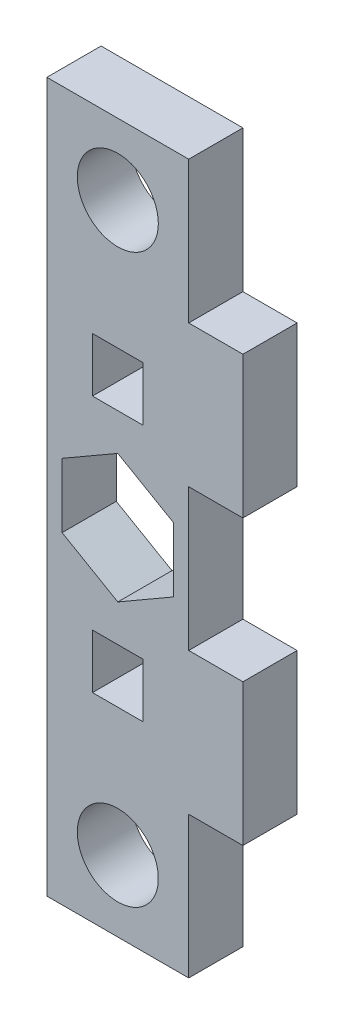
ISO-10303-21;
HEADER;
FILE_DESCRIPTION(('STEP AP214'),'2;1');
FILE_NAME('part.step','',(''),(''),'','','');
FILE_SCHEMA(('AUTOMOTIVE_DESIGN { 1 0 10303 214 1 1 1 1 }'));
ENDSEC;
DATA;
#1=APPLICATION_CONTEXT('core data for automotive mechanical design processes');
#2=APPLICATION_PROTOCOL_DEFINITION('international standard','automotive_design',2000,#1);
#3=PRODUCT_CONTEXT('',#1,'mechanical');
#4=PRODUCT('Part','Part','',(#3));
#5=PRODUCT_RELATED_PRODUCT_CATEGORY('part','',(#4));
#6=PRODUCT_DEFINITION_FORMATION('','',#4);
#7=PRODUCT_DEFINITION_CONTEXT('part definition',#1,'design');
#8=PRODUCT_DEFINITION('design','',#6,#7);
#9=PRODUCT_DEFINITION_SHAPE('','',#8);
#10=(LENGTH_UNIT() NAMED_UNIT(*) SI_UNIT(.MILLI.,.METRE.));
#11=(NAMED_UNIT(*) PLANE_ANGLE_UNIT() SI_UNIT($,.RADIAN.));
#12=(NAMED_UNIT(*) SI_UNIT($,.STERADIAN.) SOLID_ANGLE_UNIT());
#13=UNCERTAINTY_MEASURE_WITH_UNIT(LENGTH_MEASURE(1.E-05),#10,'distance_accuracy_value','');
#14=(GEOMETRIC_REPRESENTATION_CONTEXT(3) GLOBAL_UNCERTAINTY_ASSIGNED_CONTEXT((#13)) GLOBAL_UNIT_ASSIGNED_CONTEXT((#10,
#11,#12)) REPRESENTATION_CONTEXT('',''));
#15=CARTESIAN_POINT('',(0.,0.,0.));
#16=DIRECTION('',(0.,0.,1.));
#17=DIRECTION('',(1.,0.,0.));
#18=AXIS2_PLACEMENT_3D('',#15,#16,#17);
#19=CARTESIAN_POINT('',(0.,0.,5.35));
#20=DIRECTION('',(0.,0.,-1.));
#21=DIRECTION('',(-1.,0.,0.));
#22=AXIS2_PLACEMENT_3D('',#19,#20,#21);
#23=PLANE('',#22);
#24=CARTESIAN_POINT('',(7.,7.00000000000001,5.35));
#25=DIRECTION('',(0.,0.,1.));
#26=DIRECTION('',(-1.,0.,0.));
#27=AXIS2_PLACEMENT_3D('',#24,#25,#26);
#28=CIRCLE('',#27,4.);
#29=CARTESIAN_POINT('',(3.,7.00000000000001,5.35));
#30=VERTEX_POINT('',#29);
#31=EDGE_CURVE('E256',#30,#30,#28,.T.);
#32=ORIENTED_EDGE('',*,*,#31,.F.);
#33=EDGE_LOOP('',(#32));
#34=FACE_BOUND('',#33,.T.);
#35=DIRECTION('',(0.,-1.,0.));
#36=VECTOR('',#35,1.);
#37=CARTESIAN_POINT('',(4.5,25.,5.35));
#38=LINE('',#37,#36);
#39=CARTESIAN_POINT('',(4.5,25.,5.35));
#40=VERTEX_POINT('',#39);
#41=CARTESIAN_POINT('',(4.5,19.65,5.35));
#42=VERTEX_POINT('',#41);
#43=EDGE_CURVE('E262',#40,#42,#38,.T.);
#44=ORIENTED_EDGE('',*,*,#43,.F.);
#45=DIRECTION('',(-1.,0.,0.));
#46=VECTOR('',#45,1.);
#47=CARTESIAN_POINT('',(4.5,25.,5.35));
#48=LINE('',#47,#46);
#49=CARTESIAN_POINT('',(9.5,25.,5.35));
#50=VERTEX_POINT('',#49);
#51=EDGE_CURVE('E270',#50,#40,#48,.T.);
#52=ORIENTED_EDGE('',*,*,#51,.F.);
#53=DIRECTION('',(0.,1.,0.));
#54=VECTOR('',#53,1.);
#55=CARTESIAN_POINT('',(9.5,25.,5.35));
#56=LINE('',#55,#54);
#57=CARTESIAN_POINT('',(9.5,19.65,5.35));
#58=VERTEX_POINT('',#57);
#59=EDGE_CURVE('E267',#58,#50,#56,.T.);
#60=ORIENTED_EDGE('',*,*,#59,.F.);
#61=DIRECTION('',(1.,0.,0.));
#62=VECTOR('',#61,1.);
#63=CARTESIAN_POINT('',(4.5,19.65,5.35));
#64=LINE('',#63,#62);
#65=EDGE_CURVE('E264',#42,#58,#64,.T.);
#66=ORIENTED_EDGE('',*,*,#65,.F.);
#67=EDGE_LOOP('',(#44,#52,#60,#66));
#68=FACE_BOUND('',#67,.T.);
#69=CARTESIAN_POINT('',(7.,63.,5.35));
#70=DIRECTION('',(0.,0.,1.));
#71=DIRECTION('',(1.,0.,0.));
#72=AXIS2_PLACEMENT_3D('',#69,#70,#71);
#73=CIRCLE('',#72,4.);
#74=CARTESIAN_POINT('',(11.,63.,5.35));
#75=VERTEX_POINT('',#74);
#76=EDGE_CURVE('E324',#75,#75,#73,.T.);
#77=ORIENTED_EDGE('',*,*,#76,.F.);
#78=EDGE_LOOP('',(#77));
#79=FACE_BOUND('',#78,.T.);
#80=DIRECTION('',(0.,-1.,0.));
#81=VECTOR('',#80,1.);
#82=CARTESIAN_POINT('',(0.,0.,5.35));
#83=LINE('',#82,#81);
#84=CARTESIAN_POINT('',(0.,70.,5.35));
#85=VERTEX_POINT('',#84);
#86=CARTESIAN_POINT('',(0.,0.,5.35));
#87=VERTEX_POINT('',#86);
#88=EDGE_CURVE('E330',#85,#87,#83,.T.);
#89=ORIENTED_EDGE('',*,*,#88,.T.);
#90=DIRECTION('',(1.,0.,0.));
#91=VECTOR('',#90,1.);
#92=CARTESIAN_POINT('',(0.,0.,5.35));
#93=LINE('',#92,#91);
#94=CARTESIAN_POINT('',(14.,0.,5.35));
#95=VERTEX_POINT('',#94);
#96=EDGE_CURVE('E333',#87,#95,#93,.T.);
#97=ORIENTED_EDGE('',*,*,#96,.T.);
#98=DIRECTION('',(0.,1.,0.));
#99=VECTOR('',#98,1.);
#100=CARTESIAN_POINT('',(14.,0.,5.35));
#101=LINE('',#100,#99);
#102=CARTESIAN_POINT('',(14.,14.,5.35));
#103=VERTEX_POINT('',#102);
#104=EDGE_CURVE('E336',#95,#103,#101,.T.);
#105=ORIENTED_EDGE('',*,*,#104,.T.);
#106=DIRECTION('',(1.,0.,0.));
#107=VECTOR('',#106,1.);
#108=CARTESIAN_POINT('',(14.,14.,5.35));
#109=LINE('',#108,#107);
#110=CARTESIAN_POINT('',(19.35,14.,5.35));
#111=VERTEX_POINT('',#110);
#112=EDGE_CURVE('E338',#103,#111,#109,.T.);
#113=ORIENTED_EDGE('',*,*,#112,.T.);
#114=DIRECTION('',(0.,1.,0.));
#115=VECTOR('',#114,1.);
#116=CARTESIAN_POINT('',(19.35,14.,5.35));
#117=LINE('',#116,#115);
#118=CARTESIAN_POINT('',(19.35,28.,5.35));
#119=VERTEX_POINT('',#118);
#120=EDGE_CURVE('E340',#111,#119,#117,.T.);
#121=ORIENTED_EDGE('',*,*,#120,.T.);
#122=DIRECTION('',(-1.,0.,0.));
#123=VECTOR('',#122,1.);
#124=CARTESIAN_POINT('',(14.,28.,5.35));
#125=LINE('',#124,#123);
#126=CARTESIAN_POINT('',(14.,28.,5.35));
#127=VERTEX_POINT('',#126);
#128=EDGE_CURVE('E342',#119,#127,#125,.T.);
#129=ORIENTED_EDGE('',*,*,#128,.T.);
#130=DIRECTION('',(0.,1.,0.));
#131=VECTOR('',#130,1.);
#132=CARTESIAN_POINT('',(14.,28.,5.35));
#133=LINE('',#132,#131);
#134=CARTESIAN_POINT('',(14.,42.,5.35));
#135=VERTEX_POINT('',#134);
#136=EDGE_CURVE('E344',#127,#135,#133,.T.);
#137=ORIENTED_EDGE('',*,*,#136,.T.);
#138=DIRECTION('',(1.,0.,0.));
#139=VECTOR('',#138,1.);
#140=CARTESIAN_POINT('',(14.,42.,5.35));
#141=LINE('',#140,#139);
#142=CARTESIAN_POINT('',(19.35,42.,5.35));
#143=VERTEX_POINT('',#142);
#144=EDGE_CURVE('E346',#135,#143,#141,.T.);
#145=ORIENTED_EDGE('',*,*,#144,.T.);
#146=DIRECTION('',(0.,1.,0.));
#147=VECTOR('',#146,1.);
#148=CARTESIAN_POINT('',(19.35,56.,5.35));
#149=LINE('',#148,#147);
#150=CARTESIAN_POINT('',(19.35,56.,5.35));
#151=VERTEX_POINT('',#150);
#152=EDGE_CURVE('E348',#143,#151,#149,.T.);
#153=ORIENTED_EDGE('',*,*,#152,.T.);
#154=DIRECTION('',(-1.,0.,0.));
#155=VECTOR('',#154,1.);
#156=CARTESIAN_POINT('',(14.,56.,5.35));
#157=LINE('',#156,#155);
#158=CARTESIAN_POINT('',(14.,56.,5.35));
#159=VERTEX_POINT('',#158);
#160=EDGE_CURVE('E350',#151,#159,#157,.T.);
#161=ORIENTED_EDGE('',*,*,#160,.T.);
#162=DIRECTION('',(0.,1.,0.));
#163=VECTOR('',#162,1.);
#164=CARTESIAN_POINT('',(14.,56.,5.35));
#165=LINE('',#164,#163);
#166=CARTESIAN_POINT('',(14.,70.,5.35));
#167=VERTEX_POINT('',#166);
#168=EDGE_CURVE('E352',#159,#167,#165,.T.);
#169=ORIENTED_EDGE('',*,*,#168,.T.);
#170=DIRECTION('',(-1.,0.,0.));
#171=VECTOR('',#170,1.);
#172=CARTESIAN_POINT('',(0.,70.,5.35));
#173=LINE('',#172,#171);
#174=EDGE_CURVE('E354',#167,#85,#173,.T.);
#175=ORIENTED_EDGE('',*,*,#174,.T.);
#176=EDGE_LOOP('',(#89,#97,#105,#113,#121,#129,#137,#145,#153,#161,#169,#175));
#177=FACE_BOUND('',#176,.T.);
#178=DIRECTION('',(0.,1.,0.));
#179=VECTOR('',#178,1.);
#180=CARTESIAN_POINT('',(9.5,45.,5.35));
#181=LINE('',#180,#179);
#182=CARTESIAN_POINT('',(9.5,45.,5.35));
#183=VERTEX_POINT('',#182);
#184=CARTESIAN_POINT('',(9.5,50.35,5.35));
#185=VERTEX_POINT('',#184);
#186=EDGE_CURVE('E293',#183,#185,#181,.T.);
#187=ORIENTED_EDGE('',*,*,#186,.F.);
#188=DIRECTION('',(1.,0.,0.));
#189=VECTOR('',#188,1.);
#190=CARTESIAN_POINT('',(4.5,45.,5.35));
#191=LINE('',#190,#189);
#192=CARTESIAN_POINT('',(4.5,45.,5.35));
#193=VERTEX_POINT('',#192);
#194=EDGE_CURVE('E301',#193,#183,#191,.T.);
#195=ORIENTED_EDGE('',*,*,#194,.F.);
#196=DIRECTION('',(0.,-1.,0.));
#197=VECTOR('',#196,1.);
#198=CARTESIAN_POINT('',(4.5,45.,5.35));
#199=LINE('',#198,#197);
#200=CARTESIAN_POINT('',(4.5,50.35,5.35));
#201=VERTEX_POINT('',#200);
#202=EDGE_CURVE('E298',#201,#193,#199,.T.);
#203=ORIENTED_EDGE('',*,*,#202,.F.);
#204=DIRECTION('',(-1.,0.,0.));
#205=VECTOR('',#204,1.);
#206=CARTESIAN_POINT('',(4.5,50.35,5.35));
#207=LINE('',#206,#205);
#208=EDGE_CURVE('E295',#185,#201,#207,.T.);
#209=ORIENTED_EDGE('',*,*,#208,.F.);
#210=EDGE_LOOP('',(#187,#195,#203,#209));
#211=FACE_BOUND('',#210,.T.);
#212=DIRECTION('',(-0.866025403784439,-0.499999999999999,0.));
#213=VECTOR('',#212,1.);
#214=CARTESIAN_POINT('',(7.,41.35,5.35));
#215=LINE('',#214,#213);
#216=CARTESIAN_POINT('',(7.,41.35,5.35));
#217=VERTEX_POINT('',#216);
#218=CARTESIAN_POINT('',(1.50073868596882,38.175,5.35));
#219=VERTEX_POINT('',#218);
#220=EDGE_CURVE('E205',#217,#219,#215,.T.);
#221=ORIENTED_EDGE('',*,*,#220,.F.);
#222=DIRECTION('',(-0.866025403784439,0.5,0.));
#223=VECTOR('',#222,1.);
#224=CARTESIAN_POINT('',(12.4992613140312,38.175,5.35));
#225=LINE('',#224,#223);
#226=CARTESIAN_POINT('',(12.4992613140312,38.175,5.35));
#227=VERTEX_POINT('',#226);
#228=EDGE_CURVE('E234',#227,#217,#225,.T.);
#229=ORIENTED_EDGE('',*,*,#228,.F.);
#230=DIRECTION('',(0.,1.,0.));
#231=VECTOR('',#230,1.);
#232=CARTESIAN_POINT('',(12.4992613140312,31.825,5.35));
#233=LINE('',#232,#231);
#234=CARTESIAN_POINT('',(12.4992613140312,31.825,5.35));
#235=VERTEX_POINT('',#234);
#236=EDGE_CURVE('E232',#235,#227,#233,.T.);
#237=ORIENTED_EDGE('',*,*,#236,.F.);
#238=DIRECTION('',(0.86602540378444,0.499999999999998,0.));
#239=VECTOR('',#238,1.);
#240=CARTESIAN_POINT('',(7.00000000000001,28.65,5.35));
#241=LINE('',#240,#239);
#242=CARTESIAN_POINT('',(7.00000000000001,28.65,5.35));
#243=VERTEX_POINT('',#242);
#244=EDGE_CURVE('E228',#243,#235,#241,.T.);
#245=ORIENTED_EDGE('',*,*,#244,.F.);
#246=DIRECTION('',(0.866025403784439,-0.5,0.));
#247=VECTOR('',#246,1.);
#248=CARTESIAN_POINT('',(1.50073868596881,31.825,5.35));
#249=LINE('',#248,#247);
#250=CARTESIAN_POINT('',(1.50073868596881,31.825,5.35));
#251=VERTEX_POINT('',#250);
#252=EDGE_CURVE('E226',#251,#243,#249,.T.);
#253=ORIENTED_EDGE('',*,*,#252,.F.);
#254=DIRECTION('',(0.,-1.,0.));
#255=VECTOR('',#254,1.);
#256=CARTESIAN_POINT('',(1.50073868596882,38.175,5.35));
#257=LINE('',#256,#255);
#258=EDGE_CURVE('E213',#219,#251,#257,.T.);
#259=ORIENTED_EDGE('',*,*,#258,.F.);
#260=EDGE_LOOP('',(#221,#229,#237,#245,#253,#259));
#261=FACE_BOUND('',#260,.T.);
#262=ADVANCED_FACE('F32',(#34,#68,#79,#177,#211,#261),#23,.F.);
#263=CARTESIAN_POINT('',(0.,0.,0.));
#264=DIRECTION('',(0.,0.,-1.));
#265=DIRECTION('',(-1.,0.,0.));
#266=AXIS2_PLACEMENT_3D('',#263,#264,#265);
#267=PLANE('',#266);
#268=DIRECTION('',(-1.,0.,0.));
#269=VECTOR('',#268,1.);
#270=CARTESIAN_POINT('',(4.5,25.,0.));
#271=LINE('',#270,#269);
#272=CARTESIAN_POINT('',(9.5,25.,0.));
#273=VERTEX_POINT('',#272);
#274=CARTESIAN_POINT('',(4.5,25.,0.));
#275=VERTEX_POINT('',#274);
#276=EDGE_CURVE('E265',#273,#275,#271,.T.);
#277=ORIENTED_EDGE('',*,*,#276,.T.);
#278=DIRECTION('',(0.,-1.,0.));
#279=VECTOR('',#278,1.);
#280=CARTESIAN_POINT('',(4.5,25.,0.));
#281=LINE('',#280,#279);
#282=CARTESIAN_POINT('',(4.5,19.65,0.));
#283=VERTEX_POINT('',#282);
#284=EDGE_CURVE('E259',#275,#283,#281,.T.);
#285=ORIENTED_EDGE('',*,*,#284,.T.);
#286=DIRECTION('',(1.,0.,0.));
#287=VECTOR('',#286,1.);
#288=CARTESIAN_POINT('',(4.5,19.65,0.));
#289=LINE('',#288,#287);
#290=CARTESIAN_POINT('',(9.5,19.65,0.));
#291=VERTEX_POINT('',#290);
#292=EDGE_CURVE('E275',#283,#291,#289,.T.);
#293=ORIENTED_EDGE('',*,*,#292,.T.);
#294=DIRECTION('',(0.,1.,0.));
#295=VECTOR('',#294,1.);
#296=CARTESIAN_POINT('',(9.5,25.,0.));
#297=LINE('',#296,#295);
#298=EDGE_CURVE('E278',#291,#273,#297,.T.);
#299=ORIENTED_EDGE('',*,*,#298,.T.);
#300=EDGE_LOOP('',(#277,#285,#293,#299));
#301=FACE_BOUND('',#300,.T.);
#302=DIRECTION('',(1.,0.,0.));
#303=VECTOR('',#302,1.);
#304=CARTESIAN_POINT('',(4.5,45.,0.));
#305=LINE('',#304,#303);
#306=CARTESIAN_POINT('',(4.5,45.,0.));
#307=VERTEX_POINT('',#306);
#308=CARTESIAN_POINT('',(9.5,45.,0.));
#309=VERTEX_POINT('',#308);
#310=EDGE_CURVE('E296',#307,#309,#305,.T.);
#311=ORIENTED_EDGE('',*,*,#310,.T.);
#312=DIRECTION('',(0.,1.,0.));
#313=VECTOR('',#312,1.);
#314=CARTESIAN_POINT('',(9.5,45.,0.));
#315=LINE('',#314,#313);
#316=CARTESIAN_POINT('',(9.5,50.35,0.));
#317=VERTEX_POINT('',#316);
#318=EDGE_CURVE('E292',#309,#317,#315,.T.);
#319=ORIENTED_EDGE('',*,*,#318,.T.);
#320=DIRECTION('',(-1.,0.,0.));
#321=VECTOR('',#320,1.);
#322=CARTESIAN_POINT('',(4.5,50.35,0.));
#323=LINE('',#322,#321);
#324=CARTESIAN_POINT('',(4.5,50.35,0.));
#325=VERTEX_POINT('',#324);
#326=EDGE_CURVE('E306',#317,#325,#323,.T.);
#327=ORIENTED_EDGE('',*,*,#326,.T.);
#328=DIRECTION('',(0.,-1.,0.));
#329=VECTOR('',#328,1.);
#330=CARTESIAN_POINT('',(4.5,45.,0.));
#331=LINE('',#330,#329);
#332=EDGE_CURVE('E309',#325,#307,#331,.T.);
#333=ORIENTED_EDGE('',*,*,#332,.T.);
#334=EDGE_LOOP('',(#311,#319,#327,#333));
#335=FACE_BOUND('',#334,.T.);
#336=CARTESIAN_POINT('',(7.,63.,0.));
#337=DIRECTION('',(0.,0.,1.));
#338=DIRECTION('',(1.,0.,0.));
#339=AXIS2_PLACEMENT_3D('',#336,#337,#338);
#340=CIRCLE('',#339,4.);
#341=CARTESIAN_POINT('',(11.,63.,0.));
#342=VERTEX_POINT('',#341);
#343=EDGE_CURVE('E323',#342,#342,#340,.T.);
#344=ORIENTED_EDGE('',*,*,#343,.T.);
#345=EDGE_LOOP('',(#344));
#346=FACE_BOUND('',#345,.T.);
#347=DIRECTION('',(0.,-1.,0.));
#348=VECTOR('',#347,1.);
#349=CARTESIAN_POINT('',(0.,0.,0.));
#350=LINE('',#349,#348);
#351=CARTESIAN_POINT('',(0.,70.,0.));
#352=VERTEX_POINT('',#351);
#353=CARTESIAN_POINT('',(0.,0.,0.));
#354=VERTEX_POINT('',#353);
#355=EDGE_CURVE('E327',#352,#354,#350,.T.);
#356=ORIENTED_EDGE('',*,*,#355,.F.);
#357=DIRECTION('',(-1.,0.,0.));
#358=VECTOR('',#357,1.);
#359=CARTESIAN_POINT('',(0.,70.,0.));
#360=LINE('',#359,#358);
#361=CARTESIAN_POINT('',(14.,70.,0.));
#362=VERTEX_POINT('',#361);
#363=EDGE_CURVE('E334',#362,#352,#360,.T.);
#364=ORIENTED_EDGE('',*,*,#363,.F.);
#365=DIRECTION('',(0.,1.,0.));
#366=VECTOR('',#365,1.);
#367=CARTESIAN_POINT('',(14.,56.,0.));
#368=LINE('',#367,#366);
#369=CARTESIAN_POINT('',(14.,56.,0.));
#370=VERTEX_POINT('',#369);
#371=EDGE_CURVE('E377',#370,#362,#368,.T.);
#372=ORIENTED_EDGE('',*,*,#371,.F.);
#373=DIRECTION('',(-1.,0.,0.));
#374=VECTOR('',#373,1.);
#375=CARTESIAN_POINT('',(14.,56.,0.));
#376=LINE('',#375,#374);
#377=CARTESIAN_POINT('',(19.35,56.,0.));
#378=VERTEX_POINT('',#377);
#379=EDGE_CURVE('E375',#378,#370,#376,.T.);
#380=ORIENTED_EDGE('',*,*,#379,.F.);
#381=DIRECTION('',(0.,1.,0.));
#382=VECTOR('',#381,1.);
#383=CARTESIAN_POINT('',(19.35,56.,0.));
#384=LINE('',#383,#382);
#385=CARTESIAN_POINT('',(19.35,42.,0.));
#386=VERTEX_POINT('',#385);
#387=EDGE_CURVE('E373',#386,#378,#384,.T.);
#388=ORIENTED_EDGE('',*,*,#387,.F.);
#389=DIRECTION('',(1.,0.,0.));
#390=VECTOR('',#389,1.);
#391=CARTESIAN_POINT('',(14.,42.,0.));
#392=LINE('',#391,#390);
#393=CARTESIAN_POINT('',(14.,42.,0.));
#394=VERTEX_POINT('',#393);
#395=EDGE_CURVE('E371',#394,#386,#392,.T.);
#396=ORIENTED_EDGE('',*,*,#395,.F.);
#397=DIRECTION('',(0.,1.,0.));
#398=VECTOR('',#397,1.);
#399=CARTESIAN_POINT('',(14.,28.,0.));
#400=LINE('',#399,#398);
#401=CARTESIAN_POINT('',(14.,28.,0.));
#402=VERTEX_POINT('',#401);
#403=EDGE_CURVE('E369',#402,#394,#400,.T.);
#404=ORIENTED_EDGE('',*,*,#403,.F.);
#405=DIRECTION('',(-1.,0.,0.));
#406=VECTOR('',#405,1.);
#407=CARTESIAN_POINT('',(14.,28.,0.));
#408=LINE('',#407,#406);
#409=CARTESIAN_POINT('',(19.35,28.,0.));
#410=VERTEX_POINT('',#409);
#411=EDGE_CURVE('E367',#410,#402,#408,.T.);
#412=ORIENTED_EDGE('',*,*,#411,.F.);
#413=DIRECTION('',(0.,1.,0.));
#414=VECTOR('',#413,1.);
#415=CARTESIAN_POINT('',(19.35,14.,0.));
#416=LINE('',#415,#414);
#417=CARTESIAN_POINT('',(19.35,14.,0.));
#418=VERTEX_POINT('',#417);
#419=EDGE_CURVE('E365',#418,#410,#416,.T.);
#420=ORIENTED_EDGE('',*,*,#419,.F.);
#421=DIRECTION('',(1.,0.,0.));
#422=VECTOR('',#421,1.);
#423=CARTESIAN_POINT('',(14.,14.,0.));
#424=LINE('',#423,#422);
#425=CARTESIAN_POINT('',(14.,14.,0.));
#426=VERTEX_POINT('',#425);
#427=EDGE_CURVE('E363',#426,#418,#424,.T.);
#428=ORIENTED_EDGE('',*,*,#427,.F.);
#429=DIRECTION('',(0.,1.,0.));
#430=VECTOR('',#429,1.);
#431=CARTESIAN_POINT('',(14.,0.,0.));
#432=LINE('',#431,#430);
#433=CARTESIAN_POINT('',(14.,0.,0.));
#434=VERTEX_POINT('',#433);
#435=EDGE_CURVE('E361',#434,#426,#432,.T.);
#436=ORIENTED_EDGE('',*,*,#435,.F.);
#437=DIRECTION('',(1.,0.,0.));
#438=VECTOR('',#437,1.);
#439=CARTESIAN_POINT('',(0.,0.,0.));
#440=LINE('',#439,#438);
#441=EDGE_CURVE('E359',#354,#434,#440,.T.);
#442=ORIENTED_EDGE('',*,*,#441,.F.);
#443=EDGE_LOOP('',(#356,#364,#372,#380,#388,#396,#404,#412,#420,#428,#436,#442));
#444=FACE_BOUND('',#443,.T.);
#445=CARTESIAN_POINT('',(7.,7.00000000000001,0.));
#446=DIRECTION('',(0.,0.,1.));
#447=DIRECTION('',(-1.,0.,0.));
#448=AXIS2_PLACEMENT_3D('',#445,#446,#447);
#449=CIRCLE('',#448,4.);
#450=CARTESIAN_POINT('',(3.,7.00000000000001,0.));
#451=VERTEX_POINT('',#450);
#452=EDGE_CURVE('E221',#451,#451,#449,.T.);
#453=ORIENTED_EDGE('',*,*,#452,.T.);
#454=EDGE_LOOP('',(#453));
#455=FACE_BOUND('',#454,.T.);
#456=DIRECTION('',(-0.866025403784439,0.5,0.));
#457=VECTOR('',#456,1.);
#458=CARTESIAN_POINT('',(12.4992613140312,38.175,0.));
#459=LINE('',#458,#457);
#460=CARTESIAN_POINT('',(12.4992613140312,38.175,0.));
#461=VERTEX_POINT('',#460);
#462=CARTESIAN_POINT('',(7.,41.35,0.));
#463=VERTEX_POINT('',#462);
#464=EDGE_CURVE('E214',#461,#463,#459,.T.);
#465=ORIENTED_EDGE('',*,*,#464,.T.);
#466=DIRECTION('',(-0.866025403784439,-0.499999999999999,0.));
#467=VECTOR('',#466,1.);
#468=CARTESIAN_POINT('',(7.,41.35,0.));
#469=LINE('',#468,#467);
#470=CARTESIAN_POINT('',(1.50073868596882,38.175,0.));
#471=VERTEX_POINT('',#470);
#472=EDGE_CURVE('E55',#463,#471,#469,.T.);
#473=ORIENTED_EDGE('',*,*,#472,.T.);
#474=DIRECTION('',(0.,-1.,0.));
#475=VECTOR('',#474,1.);
#476=CARTESIAN_POINT('',(1.50073868596882,38.175,0.));
#477=LINE('',#476,#475);
#478=CARTESIAN_POINT('',(1.50073868596881,31.825,0.));
#479=VERTEX_POINT('',#478);
#480=EDGE_CURVE('E220',#471,#479,#477,.T.);
#481=ORIENTED_EDGE('',*,*,#480,.T.);
#482=DIRECTION('',(0.866025403784439,-0.5,0.));
#483=VECTOR('',#482,1.);
#484=CARTESIAN_POINT('',(1.50073868596881,31.825,0.));
#485=LINE('',#484,#483);
#486=CARTESIAN_POINT('',(7.00000000000001,28.65,0.));
#487=VERTEX_POINT('',#486);
#488=EDGE_CURVE('E238',#479,#487,#485,.T.);
#489=ORIENTED_EDGE('',*,*,#488,.T.);
#490=DIRECTION('',(0.86602540378444,0.499999999999998,0.));
#491=VECTOR('',#490,1.);
#492=CARTESIAN_POINT('',(7.00000000000001,28.65,0.));
#493=LINE('',#492,#491);
#494=CARTESIAN_POINT('',(12.4992613140312,31.825,0.));
#495=VERTEX_POINT('',#494);
#496=EDGE_CURVE('E241',#487,#495,#493,.T.);
#497=ORIENTED_EDGE('',*,*,#496,.T.);
#498=DIRECTION('',(0.,1.,0.));
#499=VECTOR('',#498,1.);
#500=CARTESIAN_POINT('',(12.4992613140312,31.825,0.));
#501=LINE('',#500,#499);
#502=EDGE_CURVE('E244',#495,#461,#501,.T.);
#503=ORIENTED_EDGE('',*,*,#502,.T.);
#504=EDGE_LOOP('',(#465,#473,#481,#489,#497,#503));
#505=FACE_BOUND('',#504,.T.);
#506=ADVANCED_FACE('F419',(#301,#335,#346,#444,#455,#505),#267,.T.);
#507=CARTESIAN_POINT('',(0.,0.,5.35));
#508=DIRECTION('',(1.,0.,0.));
#509=DIRECTION('',(0.,0.,-1.));
#510=AXIS2_PLACEMENT_3D('',#507,#508,#509);
#511=PLANE('',#510);
#512=ORIENTED_EDGE('',*,*,#355,.T.);
#513=DIRECTION('',(0.,0.,-1.));
#514=VECTOR('',#513,1.);
#515=CARTESIAN_POINT('',(0.,0.,5.35));
#516=LINE('',#515,#514);
#517=EDGE_CURVE('E11',#87,#354,#516,.T.);
#518=ORIENTED_EDGE('',*,*,#517,.F.);
#519=ORIENTED_EDGE('',*,*,#88,.F.);
#520=DIRECTION('',(0.,0.,-1.));
#521=VECTOR('',#520,1.);
#522=CARTESIAN_POINT('',(0.,70.,5.35));
#523=LINE('',#522,#521);
#524=EDGE_CURVE('E356',#85,#352,#523,.T.);
#525=ORIENTED_EDGE('',*,*,#524,.T.);
#526=EDGE_LOOP('',(#512,#518,#519,#525));
#527=FACE_BOUND('',#526,.T.);
#528=ADVANCED_FACE('F34',(#527),#511,.F.);
#529=CARTESIAN_POINT('',(0.,0.,5.35));
#530=DIRECTION('',(0.,1.,0.));
#531=DIRECTION('',(0.,0.,1.));
#532=AXIS2_PLACEMENT_3D('',#529,#530,#531);
#533=PLANE('',#532);
#534=ORIENTED_EDGE('',*,*,#441,.T.);
#535=DIRECTION('',(0.,0.,-1.));
#536=VECTOR('',#535,1.);
#537=CARTESIAN_POINT('',(14.,0.,5.35));
#538=LINE('',#537,#536);
#539=EDGE_CURVE('E40',#95,#434,#538,.T.);
#540=ORIENTED_EDGE('',*,*,#539,.F.);
#541=ORIENTED_EDGE('',*,*,#96,.F.);
#542=ORIENTED_EDGE('',*,*,#517,.T.);
#543=EDGE_LOOP('',(#534,#540,#541,#542));
#544=FACE_BOUND('',#543,.T.);
#545=ADVANCED_FACE('F437',(#544),#533,.F.);
#546=CARTESIAN_POINT('',(14.,0.,5.35));
#547=DIRECTION('',(-1.,0.,0.));
#548=DIRECTION('',(0.,0.,1.));
#549=AXIS2_PLACEMENT_3D('',#546,#547,#548);
#550=PLANE('',#549);
#551=ORIENTED_EDGE('',*,*,#435,.T.);
#552=DIRECTION('',(0.,0.,-1.));
#553=VECTOR('',#552,1.);
#554=CARTESIAN_POINT('',(14.,14.,5.35));
#555=LINE('',#554,#553);
#556=EDGE_CURVE('E406',#103,#426,#555,.T.);
#557=ORIENTED_EDGE('',*,*,#556,.F.);
#558=ORIENTED_EDGE('',*,*,#104,.F.);
#559=ORIENTED_EDGE('',*,*,#539,.T.);
#560=EDGE_LOOP('',(#551,#557,#558,#559));
#561=FACE_BOUND('',#560,.T.);
#562=ADVANCED_FACE('F413',(#561),#550,.F.);
#563=CARTESIAN_POINT('',(14.,14.,5.35));
#564=DIRECTION('',(0.,1.,0.));
#565=DIRECTION('',(0.,0.,1.));
#566=AXIS2_PLACEMENT_3D('',#563,#564,#565);
#567=PLANE('',#566);
#568=ORIENTED_EDGE('',*,*,#427,.T.);
#569=DIRECTION('',(0.,0.,-1.));
#570=VECTOR('',#569,1.);
#571=CARTESIAN_POINT('',(19.35,14.,5.35));
#572=LINE('',#571,#570);
#573=EDGE_CURVE('E403',#111,#418,#572,.T.);
#574=ORIENTED_EDGE('',*,*,#573,.F.);
#575=ORIENTED_EDGE('',*,*,#112,.F.);
#576=ORIENTED_EDGE('',*,*,#556,.T.);
#577=EDGE_LOOP('',(#568,#574,#575,#576));
#578=FACE_BOUND('',#577,.T.);
#579=ADVANCED_FACE('F425',(#578),#567,.F.);
#580=CARTESIAN_POINT('',(19.35,14.,5.35));
#581=DIRECTION('',(-1.,0.,0.));
#582=DIRECTION('',(0.,0.,1.));
#583=AXIS2_PLACEMENT_3D('',#580,#581,#582);
#584=PLANE('',#583);
#585=ORIENTED_EDGE('',*,*,#419,.T.);
#586=DIRECTION('',(0.,0.,-1.));
#587=VECTOR('',#586,1.);
#588=CARTESIAN_POINT('',(19.35,28.,5.35));
#589=LINE('',#588,#587);
#590=EDGE_CURVE('E400',#119,#410,#589,.T.);
#591=ORIENTED_EDGE('',*,*,#590,.F.);
#592=ORIENTED_EDGE('',*,*,#120,.F.);
#593=ORIENTED_EDGE('',*,*,#573,.T.);
#594=EDGE_LOOP('',(#585,#591,#592,#593));
#595=FACE_BOUND('',#594,.T.);
#596=ADVANCED_FACE('F429',(#595),#584,.F.);
#597=CARTESIAN_POINT('',(14.,28.,5.35));
#598=DIRECTION('',(0.,-1.,0.));
#599=DIRECTION('',(0.,0.,-1.));
#600=AXIS2_PLACEMENT_3D('',#597,#598,#599);
#601=PLANE('',#600);
#602=ORIENTED_EDGE('',*,*,#411,.T.);
#603=DIRECTION('',(0.,0.,-1.));
#604=VECTOR('',#603,1.);
#605=CARTESIAN_POINT('',(14.,28.,5.35));
#606=LINE('',#605,#604);
#607=EDGE_CURVE('E397',#127,#402,#606,.T.);
#608=ORIENTED_EDGE('',*,*,#607,.F.);
#609=ORIENTED_EDGE('',*,*,#128,.F.);
#610=ORIENTED_EDGE('',*,*,#590,.T.);
#611=EDGE_LOOP('',(#602,#608,#609,#610));
#612=FACE_BOUND('',#611,.T.);
#613=ADVANCED_FACE('F470',(#612),#601,.F.);
#614=CARTESIAN_POINT('',(14.,28.,5.35));
#615=DIRECTION('',(-1.,0.,0.));
#616=DIRECTION('',(0.,0.,1.));
#617=AXIS2_PLACEMENT_3D('',#614,#615,#616);
#618=PLANE('',#617);
#619=ORIENTED_EDGE('',*,*,#403,.T.);
#620=DIRECTION('',(0.,0.,-1.));
#621=VECTOR('',#620,1.);
#622=CARTESIAN_POINT('',(14.,42.,5.35));
#623=LINE('',#622,#621);
#624=EDGE_CURVE('E394',#135,#394,#623,.T.);
#625=ORIENTED_EDGE('',*,*,#624,.F.);
#626=ORIENTED_EDGE('',*,*,#136,.F.);
#627=ORIENTED_EDGE('',*,*,#607,.T.);
#628=EDGE_LOOP('',(#619,#625,#626,#627));
#629=FACE_BOUND('',#628,.T.);
#630=ADVANCED_FACE('F468',(#629),#618,.F.);
#631=CARTESIAN_POINT('',(14.,42.,5.35));
#632=DIRECTION('',(0.,1.,0.));
#633=DIRECTION('',(0.,0.,1.));
#634=AXIS2_PLACEMENT_3D('',#631,#632,#633);
#635=PLANE('',#634);
#636=ORIENTED_EDGE('',*,*,#395,.T.);
#637=DIRECTION('',(0.,0.,-1.));
#638=VECTOR('',#637,1.);
#639=CARTESIAN_POINT('',(19.35,42.,5.35));
#640=LINE('',#639,#638);
#641=EDGE_CURVE('E391',#143,#386,#640,.T.);
#642=ORIENTED_EDGE('',*,*,#641,.F.);
#643=ORIENTED_EDGE('',*,*,#144,.F.);
#644=ORIENTED_EDGE('',*,*,#624,.T.);
#645=EDGE_LOOP('',(#636,#642,#643,#644));
#646=FACE_BOUND('',#645,.T.);
#647=ADVANCED_FACE('F464',(#646),#635,.F.);
#648=CARTESIAN_POINT('',(19.35,56.,5.35));
#649=DIRECTION('',(-1.,0.,0.));
#650=DIRECTION('',(0.,0.,1.));
#651=AXIS2_PLACEMENT_3D('',#648,#649,#650);
#652=PLANE('',#651);
#653=ORIENTED_EDGE('',*,*,#387,.T.);
#654=DIRECTION('',(0.,0.,-1.));
#655=VECTOR('',#654,1.);
#656=CARTESIAN_POINT('',(19.35,56.,5.35));
#657=LINE('',#656,#655);
#658=EDGE_CURVE('E388',#151,#378,#657,.T.);
#659=ORIENTED_EDGE('',*,*,#658,.F.);
#660=ORIENTED_EDGE('',*,*,#152,.F.);
#661=ORIENTED_EDGE('',*,*,#641,.T.);
#662=EDGE_LOOP('',(#653,#659,#660,#661));
#663=FACE_BOUND('',#662,.T.);
#664=ADVANCED_FACE('F459',(#663),#652,.F.);
#665=CARTESIAN_POINT('',(14.,56.,5.35));
#666=DIRECTION('',(0.,-1.,0.));
#667=DIRECTION('',(0.,0.,-1.));
#668=AXIS2_PLACEMENT_3D('',#665,#666,#667);
#669=PLANE('',#668);
#670=ORIENTED_EDGE('',*,*,#379,.T.);
#671=DIRECTION('',(0.,0.,-1.));
#672=VECTOR('',#671,1.);
#673=CARTESIAN_POINT('',(14.,56.,5.35));
#674=LINE('',#673,#672);
#675=EDGE_CURVE('E385',#159,#370,#674,.T.);
#676=ORIENTED_EDGE('',*,*,#675,.F.);
#677=ORIENTED_EDGE('',*,*,#160,.F.);
#678=ORIENTED_EDGE('',*,*,#658,.T.);
#679=EDGE_LOOP('',(#670,#676,#677,#678));
#680=FACE_BOUND('',#679,.T.);
#681=ADVANCED_FACE('F453',(#680),#669,.F.);
#682=CARTESIAN_POINT('',(14.,56.,5.35));
#683=DIRECTION('',(-1.,0.,0.));
#684=DIRECTION('',(0.,0.,1.));
#685=AXIS2_PLACEMENT_3D('',#682,#683,#684);
#686=PLANE('',#685);
#687=ORIENTED_EDGE('',*,*,#371,.T.);
#688=DIRECTION('',(0.,0.,-1.));
#689=VECTOR('',#688,1.);
#690=CARTESIAN_POINT('',(14.,70.,5.35));
#691=LINE('',#690,#689);
#692=EDGE_CURVE('E382',#167,#362,#691,.T.);
#693=ORIENTED_EDGE('',*,*,#692,.F.);
#694=ORIENTED_EDGE('',*,*,#168,.F.);
#695=ORIENTED_EDGE('',*,*,#675,.T.);
#696=EDGE_LOOP('',(#687,#693,#694,#695));
#697=FACE_BOUND('',#696,.T.);
#698=ADVANCED_FACE('F449',(#697),#686,.F.);
#699=CARTESIAN_POINT('',(0.,70.,5.35));
#700=DIRECTION('',(0.,-1.,0.));
#701=DIRECTION('',(0.,0.,-1.));
#702=AXIS2_PLACEMENT_3D('',#699,#700,#701);
#703=PLANE('',#702);
#704=ORIENTED_EDGE('',*,*,#363,.T.);
#705=ORIENTED_EDGE('',*,*,#524,.F.);
#706=ORIENTED_EDGE('',*,*,#174,.F.);
#707=ORIENTED_EDGE('',*,*,#692,.T.);
#708=EDGE_LOOP('',(#704,#705,#706,#707));
#709=FACE_BOUND('',#708,.T.);
#710=ADVANCED_FACE('F444',(#709),#703,.F.);
#711=CARTESIAN_POINT('',(7.,63.,5.35));
#712=DIRECTION('',(0.,0.,-1.));
#713=DIRECTION('',(-1.,0.,0.));
#714=AXIS2_PLACEMENT_3D('',#711,#712,#713);
#715=CYLINDRICAL_SURFACE('',#714,4.);
#716=ORIENTED_EDGE('',*,*,#76,.T.);
#717=EDGE_LOOP('',(#716));
#718=FACE_BOUND('',#717,.T.);
#719=ORIENTED_EDGE('',*,*,#343,.F.);
#720=EDGE_LOOP('',(#719));
#721=FACE_BOUND('',#720,.T.);
#722=ADVANCED_FACE('F490',(#718,#721),#715,.F.);
#723=CARTESIAN_POINT('',(9.5,45.,5.35));
#724=DIRECTION('',(-1.,0.,0.));
#725=DIRECTION('',(0.,0.,1.));
#726=AXIS2_PLACEMENT_3D('',#723,#724,#725);
#727=PLANE('',#726);
#728=ORIENTED_EDGE('',*,*,#318,.F.);
#729=DIRECTION('',(0.,0.,-1.));
#730=VECTOR('',#729,1.);
#731=CARTESIAN_POINT('',(9.5,45.,5.35));
#732=LINE('',#731,#730);
#733=EDGE_CURVE('E303',#183,#309,#732,.T.);
#734=ORIENTED_EDGE('',*,*,#733,.F.);
#735=ORIENTED_EDGE('',*,*,#186,.T.);
#736=DIRECTION('',(0.,0.,-1.));
#737=VECTOR('',#736,1.);
#738=CARTESIAN_POINT('',(9.5,50.35,5.35));
#739=LINE('',#738,#737);
#740=EDGE_CURVE('E320',#185,#317,#739,.T.);
#741=ORIENTED_EDGE('',*,*,#740,.T.);
#742=EDGE_LOOP('',(#728,#734,#735,#741));
#743=FACE_BOUND('',#742,.T.);
#744=ADVANCED_FACE('F528',(#743),#727,.T.);
#745=CARTESIAN_POINT('',(4.5,50.35,5.35));
#746=DIRECTION('',(0.,-1.,0.));
#747=DIRECTION('',(0.,0.,-1.));
#748=AXIS2_PLACEMENT_3D('',#745,#746,#747);
#749=PLANE('',#748);
#750=ORIENTED_EDGE('',*,*,#326,.F.);
#751=ORIENTED_EDGE('',*,*,#740,.F.);
#752=ORIENTED_EDGE('',*,*,#208,.T.);
#753=DIRECTION('',(0.,0.,-1.));
#754=VECTOR('',#753,1.);
#755=CARTESIAN_POINT('',(4.5,50.35,5.35));
#756=LINE('',#755,#754);
#757=EDGE_CURVE('E318',#201,#325,#756,.T.);
#758=ORIENTED_EDGE('',*,*,#757,.T.);
#759=EDGE_LOOP('',(#750,#751,#752,#758));
#760=FACE_BOUND('',#759,.T.);
#761=ADVANCED_FACE('F535',(#760),#749,.T.);
#762=CARTESIAN_POINT('',(4.5,45.,5.35));
#763=DIRECTION('',(1.,0.,0.));
#764=DIRECTION('',(0.,0.,-1.));
#765=AXIS2_PLACEMENT_3D('',#762,#763,#764);
#766=PLANE('',#765);
#767=ORIENTED_EDGE('',*,*,#332,.F.);
#768=ORIENTED_EDGE('',*,*,#757,.F.);
#769=ORIENTED_EDGE('',*,*,#202,.T.);
#770=DIRECTION('',(0.,0.,-1.));
#771=VECTOR('',#770,1.);
#772=CARTESIAN_POINT('',(4.5,45.,5.35));
#773=LINE('',#772,#771);
#774=EDGE_CURVE('E316',#193,#307,#773,.T.);
#775=ORIENTED_EDGE('',*,*,#774,.T.);
#776=EDGE_LOOP('',(#767,#768,#769,#775));
#777=FACE_BOUND('',#776,.T.);
#778=ADVANCED_FACE('F542',(#777),#766,.T.);
#779=CARTESIAN_POINT('',(4.5,45.,5.35));
#780=DIRECTION('',(0.,1.,0.));
#781=DIRECTION('',(0.,0.,1.));
#782=AXIS2_PLACEMENT_3D('',#779,#780,#781);
#783=PLANE('',#782);
#784=ORIENTED_EDGE('',*,*,#310,.F.);
#785=ORIENTED_EDGE('',*,*,#774,.F.);
#786=ORIENTED_EDGE('',*,*,#194,.T.);
#787=ORIENTED_EDGE('',*,*,#733,.T.);
#788=EDGE_LOOP('',(#784,#785,#786,#787));
#789=FACE_BOUND('',#788,.T.);
#790=ADVANCED_FACE('F550',(#789),#783,.T.);
#791=CARTESIAN_POINT('',(4.5,25.,5.35));
#792=DIRECTION('',(1.,0.,0.));
#793=DIRECTION('',(0.,0.,-1.));
#794=AXIS2_PLACEMENT_3D('',#791,#792,#793);
#795=PLANE('',#794);
#796=ORIENTED_EDGE('',*,*,#284,.F.);
#797=DIRECTION('',(0.,0.,-1.));
#798=VECTOR('',#797,1.);
#799=CARTESIAN_POINT('',(4.5,25.,5.35));
#800=LINE('',#799,#798);
#801=EDGE_CURVE('E272',#40,#275,#800,.T.);
#802=ORIENTED_EDGE('',*,*,#801,.F.);
#803=ORIENTED_EDGE('',*,*,#43,.T.);
#804=DIRECTION('',(0.,0.,-1.));
#805=VECTOR('',#804,1.);
#806=CARTESIAN_POINT('',(4.5,19.65,5.35));
#807=LINE('',#806,#805);
#808=EDGE_CURVE('E289',#42,#283,#807,.T.);
#809=ORIENTED_EDGE('',*,*,#808,.T.);
#810=EDGE_LOOP('',(#796,#802,#803,#809));
#811=FACE_BOUND('',#810,.T.);
#812=ADVANCED_FACE('F558',(#811),#795,.T.);
#813=CARTESIAN_POINT('',(4.5,19.65,5.35));
#814=DIRECTION('',(0.,1.,0.));
#815=DIRECTION('',(0.,0.,1.));
#816=AXIS2_PLACEMENT_3D('',#813,#814,#815);
#817=PLANE('',#816);
#818=ORIENTED_EDGE('',*,*,#292,.F.);
#819=ORIENTED_EDGE('',*,*,#808,.F.);
#820=ORIENTED_EDGE('',*,*,#65,.T.);
#821=DIRECTION('',(0.,0.,-1.));
#822=VECTOR('',#821,1.);
#823=CARTESIAN_POINT('',(9.5,19.65,5.35));
#824=LINE('',#823,#822);
#825=EDGE_CURVE('E287',#58,#291,#824,.T.);
#826=ORIENTED_EDGE('',*,*,#825,.T.);
#827=EDGE_LOOP('',(#818,#819,#820,#826));
#828=FACE_BOUND('',#827,.T.);
#829=ADVANCED_FACE('F566',(#828),#817,.T.);
#830=CARTESIAN_POINT('',(9.5,25.,5.35));
#831=DIRECTION('',(-1.,0.,0.));
#832=DIRECTION('',(0.,0.,1.));
#833=AXIS2_PLACEMENT_3D('',#830,#831,#832);
#834=PLANE('',#833);
#835=ORIENTED_EDGE('',*,*,#298,.F.);
#836=ORIENTED_EDGE('',*,*,#825,.F.);
#837=ORIENTED_EDGE('',*,*,#59,.T.);
#838=DIRECTION('',(0.,0.,-1.));
#839=VECTOR('',#838,1.);
#840=CARTESIAN_POINT('',(9.5,25.,5.35));
#841=LINE('',#840,#839);
#842=EDGE_CURVE('E285',#50,#273,#841,.T.);
#843=ORIENTED_EDGE('',*,*,#842,.T.);
#844=EDGE_LOOP('',(#835,#836,#837,#843));
#845=FACE_BOUND('',#844,.T.);
#846=ADVANCED_FACE('F574',(#845),#834,.T.);
#847=CARTESIAN_POINT('',(4.5,25.,5.35));
#848=DIRECTION('',(0.,-1.,0.));
#849=DIRECTION('',(0.,0.,-1.));
#850=AXIS2_PLACEMENT_3D('',#847,#848,#849);
#851=PLANE('',#850);
#852=ORIENTED_EDGE('',*,*,#276,.F.);
#853=ORIENTED_EDGE('',*,*,#842,.F.);
#854=ORIENTED_EDGE('',*,*,#51,.T.);
#855=ORIENTED_EDGE('',*,*,#801,.T.);
#856=EDGE_LOOP('',(#852,#853,#854,#855));
#857=FACE_BOUND('',#856,.T.);
#858=ADVANCED_FACE('F582',(#857),#851,.T.);
#859=CARTESIAN_POINT('',(7.,7.00000000000001,5.35));
#860=DIRECTION('',(0.,0.,-1.));
#861=DIRECTION('',(-1.,0.,0.));
#862=AXIS2_PLACEMENT_3D('',#859,#860,#861);
#863=CYLINDRICAL_SURFACE('',#862,4.);
#864=ORIENTED_EDGE('',*,*,#31,.T.);
#865=EDGE_LOOP('',(#864));
#866=FACE_BOUND('',#865,.T.);
#867=ORIENTED_EDGE('',*,*,#452,.F.);
#868=EDGE_LOOP('',(#867));
#869=FACE_BOUND('',#868,.T.);
#870=ADVANCED_FACE('F590',(#866,#869),#863,.F.);
#871=CARTESIAN_POINT('',(7.,41.35,5.35));
#872=DIRECTION('',(0.499999999999999,-0.866025403784439,0.));
#873=DIRECTION('',(0.866025403784439,0.499999999999999,0.));
#874=AXIS2_PLACEMENT_3D('',#871,#872,#873);
#875=PLANE('',#874);
#876=ORIENTED_EDGE('',*,*,#472,.F.);
#877=DIRECTION('',(0.,0.,-1.));
#878=VECTOR('',#877,1.);
#879=CARTESIAN_POINT('',(7.,41.35,5.35));
#880=LINE('',#879,#878);
#881=EDGE_CURVE('E209',#217,#463,#880,.T.);
#882=ORIENTED_EDGE('',*,*,#881,.F.);
#883=ORIENTED_EDGE('',*,*,#220,.T.);
#884=DIRECTION('',(0.,0.,-1.));
#885=VECTOR('',#884,1.);
#886=CARTESIAN_POINT('',(1.50073868596882,38.175,5.35));
#887=LINE('',#886,#885);
#888=EDGE_CURVE('E208',#219,#471,#887,.T.);
#889=ORIENTED_EDGE('',*,*,#888,.T.);
#890=EDGE_LOOP('',(#876,#882,#883,#889));
#891=FACE_BOUND('',#890,.T.);
#892=ADVANCED_FACE('F207',(#891),#875,.T.);
#893=CARTESIAN_POINT('',(1.50073868596882,38.175,5.35));
#894=DIRECTION('',(1.,0.,0.));
#895=DIRECTION('',(0.,1.,0.));
#896=AXIS2_PLACEMENT_3D('',#893,#894,#895);
#897=PLANE('',#896);
#898=ORIENTED_EDGE('',*,*,#480,.F.);
#899=ORIENTED_EDGE('',*,*,#888,.F.);
#900=ORIENTED_EDGE('',*,*,#258,.T.);
#901=DIRECTION('',(0.,0.,-1.));
#902=VECTOR('',#901,1.);
#903=CARTESIAN_POINT('',(1.50073868596881,31.825,5.35));
#904=LINE('',#903,#902);
#905=EDGE_CURVE('E222',#251,#479,#904,.T.);
#906=ORIENTED_EDGE('',*,*,#905,.T.);
#907=EDGE_LOOP('',(#898,#899,#900,#906));
#908=FACE_BOUND('',#907,.T.);
#909=ADVANCED_FACE('F217',(#908),#897,.T.);
#910=CARTESIAN_POINT('',(1.50073868596881,31.825,5.35));
#911=DIRECTION('',(0.5,0.866025403784439,0.));
#912=DIRECTION('',(-0.866025403784439,0.5,0.));
#913=AXIS2_PLACEMENT_3D('',#910,#911,#912);
#914=PLANE('',#913);
#915=ORIENTED_EDGE('',*,*,#488,.F.);
#916=ORIENTED_EDGE('',*,*,#905,.F.);
#917=ORIENTED_EDGE('',*,*,#252,.T.);
#918=DIRECTION('',(0.,0.,-1.));
#919=VECTOR('',#918,1.);
#920=CARTESIAN_POINT('',(7.00000000000001,28.65,5.35));
#921=LINE('',#920,#919);
#922=EDGE_CURVE('E253',#243,#487,#921,.T.);
#923=ORIENTED_EDGE('',*,*,#922,.T.);
#924=EDGE_LOOP('',(#915,#916,#917,#923));
#925=FACE_BOUND('',#924,.T.);
#926=ADVANCED_FACE('F611',(#925),#914,.T.);
#927=CARTESIAN_POINT('',(7.00000000000001,28.65,5.35));
#928=DIRECTION('',(-0.499999999999998,0.86602540378444,0.));
#929=DIRECTION('',(-0.86602540378444,-0.499999999999998,0.));
#930=AXIS2_PLACEMENT_3D('',#927,#928,#929);
#931=PLANE('',#930);
#932=ORIENTED_EDGE('',*,*,#496,.F.);
#933=ORIENTED_EDGE('',*,*,#922,.F.);
#934=ORIENTED_EDGE('',*,*,#244,.T.);
#935=DIRECTION('',(0.,0.,-1.));
#936=VECTOR('',#935,1.);
#937=CARTESIAN_POINT('',(12.4992613140312,31.825,5.35));
#938=LINE('',#937,#936);
#939=EDGE_CURVE('E251',#235,#495,#938,.T.);
#940=ORIENTED_EDGE('',*,*,#939,.T.);
#941=EDGE_LOOP('',(#932,#933,#934,#940));
#942=FACE_BOUND('',#941,.T.);
#943=ADVANCED_FACE('F618',(#942),#931,.T.);
#944=CARTESIAN_POINT('',(12.4992613140312,31.825,5.35));
#945=DIRECTION('',(-1.,0.,0.));
#946=DIRECTION('',(0.,-1.,0.));
#947=AXIS2_PLACEMENT_3D('',#944,#945,#946);
#948=PLANE('',#947);
#949=ORIENTED_EDGE('',*,*,#502,.F.);
#950=ORIENTED_EDGE('',*,*,#939,.F.);
#951=ORIENTED_EDGE('',*,*,#236,.T.);
#952=DIRECTION('',(0.,0.,-1.));
#953=VECTOR('',#952,1.);
#954=CARTESIAN_POINT('',(12.4992613140312,38.175,5.35));
#955=LINE('',#954,#953);
#956=EDGE_CURVE('E47',#227,#461,#955,.T.);
#957=ORIENTED_EDGE('',*,*,#956,.T.);
#958=EDGE_LOOP('',(#949,#950,#951,#957));
#959=FACE_BOUND('',#958,.T.);
#960=ADVANCED_FACE('F626',(#959),#948,.T.);
#961=CARTESIAN_POINT('',(12.4992613140312,38.175,5.35));
#962=DIRECTION('',(-0.5,-0.866025403784439,0.));
#963=DIRECTION('',(0.866025403784439,-0.5,0.));
#964=AXIS2_PLACEMENT_3D('',#961,#962,#963);
#965=PLANE('',#964);
#966=ORIENTED_EDGE('',*,*,#464,.F.);
#967=ORIENTED_EDGE('',*,*,#956,.F.);
#968=ORIENTED_EDGE('',*,*,#228,.T.);
#969=ORIENTED_EDGE('',*,*,#881,.T.);
#970=EDGE_LOOP('',(#966,#967,#968,#969));
#971=FACE_BOUND('',#970,.T.);
#972=ADVANCED_FACE('F634',(#971),#965,.T.);
#973=CLOSED_SHELL('',(#262,#506,#528,#545,#562,#579,#596,#613,#630,#647,#664,#681,#698,#710,
#722,#744,#761,#778,#790,#812,#829,#846,#858,#870,#892,#909,#926,#943,#960,#972));
#974=MANIFOLD_SOLID_BREP('B2',#973);
#975=ADVANCED_BREP_SHAPE_REPRESENTATION('',(#18,#974),#14);
#976=SHAPE_DEFINITION_REPRESENTATION(#9,#975);
ENDSEC;
END-ISO-10303-21;
